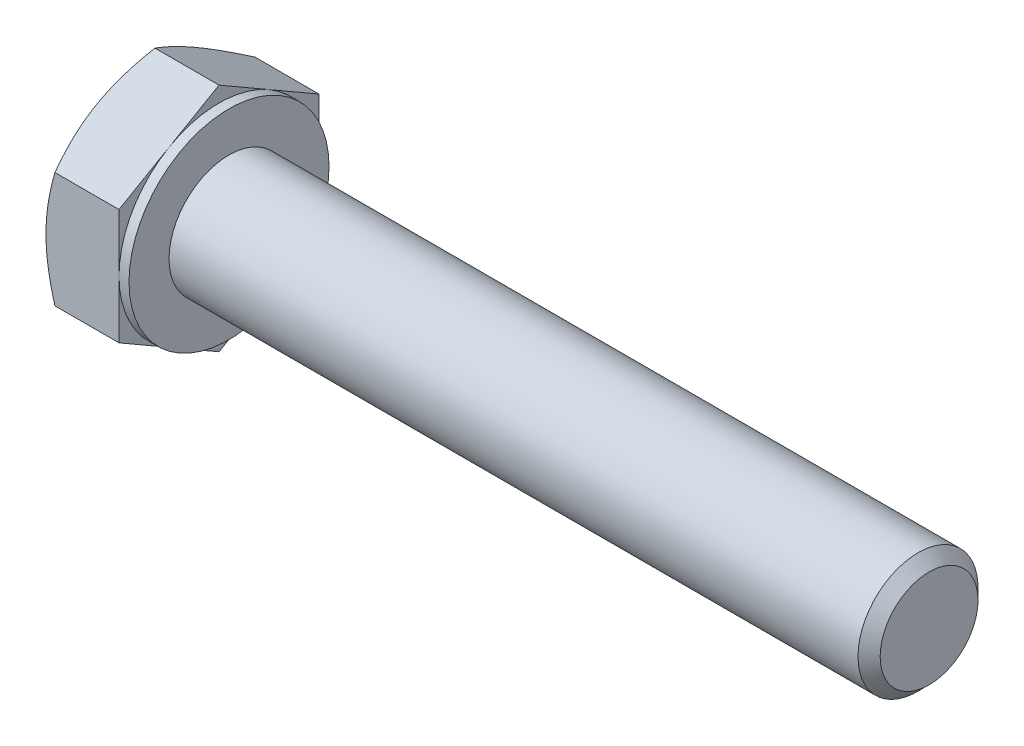
ISO-10303-21;
HEADER;
FILE_DESCRIPTION(('STEP AP214'),'2;1');
FILE_NAME('part.step','',(''),(''),'','','');
FILE_SCHEMA(('AUTOMOTIVE_DESIGN { 1 0 10303 214 1 1 1 1 }'));
ENDSEC;
DATA;
#1=APPLICATION_CONTEXT('core data for automotive mechanical design processes');
#2=APPLICATION_PROTOCOL_DEFINITION('international standard','automotive_design',2000,#1);
#3=PRODUCT_CONTEXT('',#1,'mechanical');
#4=PRODUCT('Part','Part','',(#3));
#5=PRODUCT_RELATED_PRODUCT_CATEGORY('part','',(#4));
#6=PRODUCT_DEFINITION_FORMATION('','',#4);
#7=PRODUCT_DEFINITION_CONTEXT('part definition',#1,'design');
#8=PRODUCT_DEFINITION('design','',#6,#7);
#9=PRODUCT_DEFINITION_SHAPE('','',#8);
#10=(LENGTH_UNIT() NAMED_UNIT(*) SI_UNIT(.MILLI.,.METRE.));
#11=(NAMED_UNIT(*) PLANE_ANGLE_UNIT() SI_UNIT($,.RADIAN.));
#12=(NAMED_UNIT(*) SI_UNIT($,.STERADIAN.) SOLID_ANGLE_UNIT());
#13=UNCERTAINTY_MEASURE_WITH_UNIT(LENGTH_MEASURE(1.E-05),#10,'distance_accuracy_value','');
#14=(GEOMETRIC_REPRESENTATION_CONTEXT(3) GLOBAL_UNCERTAINTY_ASSIGNED_CONTEXT((#13)) GLOBAL_UNIT_ASSIGNED_CONTEXT((#10,
#11,#12)) REPRESENTATION_CONTEXT('',''));
#15=CARTESIAN_POINT('',(0.,0.,0.));
#16=DIRECTION('',(0.,0.,1.));
#17=DIRECTION('',(1.,0.,0.));
#18=AXIS2_PLACEMENT_3D('',#15,#16,#17);
#19=CARTESIAN_POINT('',(0.,5.77350269189626,0.));
#20=DIRECTION('',(1.,0.,0.));
#21=DIRECTION('',(0.,0.,-1.));
#22=AXIS2_PLACEMENT_3D('',#19,#20,#21);
#23=PLANE('',#22);
#24=CARTESIAN_POINT('',(0.,0.,0.));
#25=DIRECTION('',(1.,0.,0.));
#26=DIRECTION('',(0.,1.,0.));
#27=AXIS2_PLACEMENT_3D('',#24,#25,#26);
#28=CIRCLE('',#27,4.99999999999545);
#29=CARTESIAN_POINT('',(1.31354746459353E-12,-4.33012701892023,-2.49999999999886));
#30=VERTEX_POINT('',#29);
#31=CARTESIAN_POINT('',(1.31275345242458E-12,0.,-4.99999999999773));
#32=VERTEX_POINT('',#31);
#33=EDGE_CURVE('E85',#30,#32,#28,.T.);
#34=ORIENTED_EDGE('',*,*,#33,.F.);
#35=CARTESIAN_POINT('',(0.,0.,0.));
#36=DIRECTION('',(1.,0.,0.));
#37=DIRECTION('',(0.,1.,0.));
#38=AXIS2_PLACEMENT_3D('',#35,#36,#37);
#39=CIRCLE('',#38,4.99999999999545);
#40=CARTESIAN_POINT('',(1.31121862056009E-12,-4.33012701892022,2.49999999999887));
#41=VERTEX_POINT('',#40);
#42=EDGE_CURVE('E20',#41,#30,#39,.T.);
#43=ORIENTED_EDGE('',*,*,#42,.F.);
#44=CARTESIAN_POINT('',(0.,0.,0.));
#45=DIRECTION('',(1.,0.,0.));
#46=DIRECTION('',(0.,1.,0.));
#47=AXIS2_PLACEMENT_3D('',#44,#45,#46);
#48=CIRCLE('',#47,4.99999999999545);
#49=CARTESIAN_POINT('',(1.31264084998215E-12,0.,4.99999999999773));
#50=VERTEX_POINT('',#49);
#51=EDGE_CURVE('E425',#50,#41,#48,.T.);
#52=ORIENTED_EDGE('',*,*,#51,.F.);
#53=CARTESIAN_POINT('',(0.,0.,0.));
#54=DIRECTION('',(1.,0.,0.));
#55=DIRECTION('',(0.,1.,0.));
#56=AXIS2_PLACEMENT_3D('',#53,#54,#55);
#57=CIRCLE('',#56,4.99999999999545);
#58=CARTESIAN_POINT('',(1.31332709353662E-12,4.33012701892022,2.49999999999887));
#59=VERTEX_POINT('',#58);
#60=EDGE_CURVE('E143',#59,#50,#57,.T.);
#61=ORIENTED_EDGE('',*,*,#60,.F.);
#62=CARTESIAN_POINT('',(0.,0.,0.));
#63=DIRECTION('',(1.,0.,0.));
#64=DIRECTION('',(0.,1.,0.));
#65=AXIS2_PLACEMENT_3D('',#62,#63,#64);
#66=CIRCLE('',#65,4.99999999999545);
#67=CARTESIAN_POINT('',(1.31270362434763E-12,4.33012701892022,-2.49999999999887));
#68=VERTEX_POINT('',#67);
#69=EDGE_CURVE('E426',#68,#59,#66,.T.);
#70=ORIENTED_EDGE('',*,*,#69,.F.);
#71=CARTESIAN_POINT('',(0.,0.,0.));
#72=DIRECTION('',(1.,0.,0.));
#73=DIRECTION('',(0.,1.,0.));
#74=AXIS2_PLACEMENT_3D('',#71,#72,#73);
#75=CIRCLE('',#74,4.99999999999545);
#76=EDGE_CURVE('E88',#32,#68,#75,.T.);
#77=ORIENTED_EDGE('',*,*,#76,.F.);
#78=EDGE_LOOP('',(#34,#43,#52,#61,#70,#77));
#79=FACE_BOUND('',#78,.T.);
#80=ADVANCED_FACE('F17',(#79),#23,.F.);
#81=CARTESIAN_POINT('',(0.449261479275265,0.,0.));
#82=DIRECTION('',(1.,0.,0.));
#83=DIRECTION('',(0.,1.,0.));
#84=AXIS2_PLACEMENT_3D('',#81,#82,#83);
#85=CONICAL_SURFACE('',#84,5.77814370797114,1.04719755118957);
#86=ORIENTED_EDGE('',*,*,#42,.T.);
#87=CARTESIAN_POINT('',(2.62704765214054E-12,-4.3301270189222,-2.5));
#88=CARTESIAN_POINT('',(-2.0434811056066E-05,-4.39139021902688,-2.39388902478443));
#89=CARTESIAN_POINT('',(0.00259979047148857,-4.45265046787549,-2.28778316129432));
#90=CARTESIAN_POINT('',(0.0129696792605237,-4.57505068020448,-2.07577977468329));
#91=CARTESIAN_POINT('',(0.020718327300213,-4.63619066509475,-1.96988221447935));
#92=CARTESIAN_POINT('',(0.0411421551416449,-4.75795543372631,-1.75897944863763));
#93=CARTESIAN_POINT('',(0.05379253368077,-4.81858126545495,-1.6539724278325));
#94=CARTESIAN_POINT('',(0.0837477080387027,-4.93954408647721,-1.44445867599508));
#95=CARTESIAN_POINT('',(0.101052626368536,-4.99988106812553,-1.33995195820484));
#96=CARTESIAN_POINT('',(0.159414596574626,-5.18020863614853,-1.02761544838367));
#97=CARTESIAN_POINT('',(0.206947202600607,-5.29967536418135,-0.820693005616806));
#98=CARTESIAN_POINT('',(0.3165695496968,-5.53758145884731,-0.408627562225077));
#99=CARTESIAN_POINT('',(0.37873199161361,-5.65601252710132,-0.203498934814473));
#100=CARTESIAN_POINT('',(0.446581987394316,-5.77350269189494,-2.27841681610176E-12));
#101=B_SPLINE_CURVE_WITH_KNOTS('',3,(#87,#88,#89,#90,#91,#92,#93,#94,#95,#96,#97,#98,#99,#100),
.UNSPECIFIED.,.F.,.F.,(4,2,2,2,2,2,4),(0.,0.367541688500244,0.735010622708302,1.10064405638254,
1.46628711474859,2.19661488877263,2.93065154716301),.UNSPECIFIED.);
#102=CARTESIAN_POINT('',(0.446581987394316,-5.77350269189494,0.));
#103=VERTEX_POINT('',#102);
#104=EDGE_CURVE('E100',#30,#103,#101,.T.);
#105=ORIENTED_EDGE('',*,*,#104,.T.);
#106=CARTESIAN_POINT('',(0.446581987394316,-5.77350269189494,2.27887825987949E-12));
#107=CARTESIAN_POINT('',(0.378731991613609,-5.65601252710132,0.203498934814475));
#108=CARTESIAN_POINT('',(0.316569549696798,-5.53758145884731,0.408627562225079));
#109=CARTESIAN_POINT('',(0.206947202600605,-5.29967536418135,0.820693005616809));
#110=CARTESIAN_POINT('',(0.159414596574623,-5.18020863614852,1.02761544838368));
#111=CARTESIAN_POINT('',(0.101052626368532,-4.99988106812552,1.33995195820485));
#112=CARTESIAN_POINT('',(0.0837477080386989,-4.9395440864772,1.44445867599509));
#113=CARTESIAN_POINT('',(0.0537925336807657,-4.81858126545494,1.65397242783251));
#114=CARTESIAN_POINT('',(0.0411421551416406,-4.7579554337263,1.75897944863763));
#115=CARTESIAN_POINT('',(0.0207183273002085,-4.63619066509474,1.96988221447936));
#116=CARTESIAN_POINT('',(0.012969679260519,-4.57505068020447,2.0757797746833));
#117=CARTESIAN_POINT('',(0.00259979047148364,-4.45265046787548,2.28778316129432));
#118=CARTESIAN_POINT('',(-2.04348110610126E-05,-4.39139021902686,2.39388902478444));
#119=CARTESIAN_POINT('',(2.62241692865757E-12,-4.33012701892218,2.50000000000001));
#120=B_SPLINE_CURVE_WITH_KNOTS('',3,(#106,#107,#108,#109,#110,#111,#112,#113,#114,#115,#116,
#117,#118,#119),.UNSPECIFIED.,.F.,.F.,(4,2,2,2,2,2,4),(0.,0.734036658390386,1.46436443241443,
1.83000749078048,2.19564092445472,2.56310985866278,2.93065154716303),.UNSPECIFIED.);
#121=EDGE_CURVE('E106',#103,#41,#120,.T.);
#122=ORIENTED_EDGE('',*,*,#121,.T.);
#123=EDGE_LOOP('',(#86,#105,#122));
#124=FACE_BOUND('',#123,.T.);
#125=ADVANCED_FACE('F104',(#124),#85,.T.);
#126=CARTESIAN_POINT('',(0.449261479275265,0.,0.));
#127=DIRECTION('',(1.,0.,0.));
#128=DIRECTION('',(0.,1.,0.));
#129=AXIS2_PLACEMENT_3D('',#126,#127,#128);
#130=CONICAL_SURFACE('',#129,5.77814370797114,1.04719755118957);
#131=ORIENTED_EDGE('',*,*,#33,.T.);
#132=CARTESIAN_POINT('',(2.62554162158813E-12,0.,-5.));
#133=CARTESIAN_POINT('',(-2.04348110577706E-05,-0.122526400209367,-5.));
#134=CARTESIAN_POINT('',(0.00259979047148719,-0.24504689790661,-5.));
#135=CARTESIAN_POINT('',(0.0129696792605238,-0.4898473225646,-5.));
#136=CARTESIAN_POINT('',(0.0207183273002142,-0.61212729234515,-5.));
#137=CARTESIAN_POINT('',(0.0411421551416489,-0.855656829608277,-5.));
#138=CARTESIAN_POINT('',(0.0537925336807756,-0.976908493065564,-5.));
#139=CARTESIAN_POINT('',(0.0837477080387122,-1.21883413511011,-5.));
#140=CARTESIAN_POINT('',(0.101052626368547,-1.33950809840675,-5.));
#141=CARTESIAN_POINT('',(0.159414596574645,-1.70016323445278,-5.));
#142=CARTESIAN_POINT('',(0.206947202600632,-1.93909669051844,-5.));
#143=CARTESIAN_POINT('',(0.316569549696838,-2.41490887985039,-5.));
#144=CARTESIAN_POINT('',(0.378731991613655,-2.65177101635842,-5.));
#145=CARTESIAN_POINT('',(0.446581987394369,-2.88675134594568,-5.));
#146=B_SPLINE_CURVE_WITH_KNOTS('',3,(#132,#133,#134,#135,#136,#137,#138,#139,#140,#141,#142,
#143,#144,#145),.UNSPECIFIED.,.F.,.F.,(4,2,2,2,2,2,4),(0.,0.367541688500269,0.735010622708351,
1.10064405638261,1.46628711474869,2.19661488877278,2.93065154716321),.UNSPECIFIED.);
#147=CARTESIAN_POINT('',(0.446581987394308,-2.88675134594763,-4.99999999999875));
#148=VERTEX_POINT('',#147);
#149=EDGE_CURVE('E95',#32,#148,#146,.T.);
#150=ORIENTED_EDGE('',*,*,#149,.T.);
#151=CARTESIAN_POINT('',(0.446581987394246,-2.88675134594957,-4.99999999999751));
#152=CARTESIAN_POINT('',(0.37873199161355,-3.00424151074319,-4.79650106518533));
#153=CARTESIAN_POINT('',(0.316569549696749,-3.12267257899719,-4.59137243777474));
#154=CARTESIAN_POINT('',(0.206947202600573,-3.36057867366312,-4.17930699438305));
#155=CARTESIAN_POINT('',(0.159414596574599,-3.48004540169594,-3.9723845516162));
#156=CARTESIAN_POINT('',(0.101052626368518,-3.66037296971892,-3.66004804179506));
#157=CARTESIAN_POINT('',(0.0837477080386884,-3.72070995136724,-3.55554132400483));
#158=CARTESIAN_POINT('',(0.0537925336807608,-3.84167277238949,-3.34602757216742));
#159=CARTESIAN_POINT('',(0.0411421551416378,-3.90229860411813,-3.24102055136231));
#160=CARTESIAN_POINT('',(0.0207183273002091,-4.02406337274967,-3.0301177855206));
#161=CARTESIAN_POINT('',(0.0129696792605209,-4.08520335763994,-2.92422022531667));
#162=CARTESIAN_POINT('',(0.00259979047148748,-4.20760356996891,-2.71221683870566));
#163=CARTESIAN_POINT('',(-2.04348110565836E-05,-4.26886381881752,-2.60611097521555));
#164=CARTESIAN_POINT('',(2.62707461672446E-12,-4.3301270189222,-2.5));
#165=B_SPLINE_CURVE_WITH_KNOTS('',3,(#151,#152,#153,#154,#155,#156,#157,#158,#159,#160,#161,
#162,#163,#164),.UNSPECIFIED.,.F.,.F.,(4,2,2,2,2,2,4),(0.,0.734036658390319,1.46436443241429,
1.83000749078032,2.19564092445452,2.56310985866255,2.93065154716276),.UNSPECIFIED.);
#166=EDGE_CURVE('E93',#148,#30,#165,.T.);
#167=ORIENTED_EDGE('',*,*,#166,.T.);
#168=EDGE_LOOP('',(#131,#150,#167));
#169=FACE_BOUND('',#168,.T.);
#170=ADVANCED_FACE('F94',(#169),#130,.T.);
#171=CARTESIAN_POINT('',(0.449261479275265,0.,0.));
#172=DIRECTION('',(1.,0.,0.));
#173=DIRECTION('',(0.,1.,0.));
#174=AXIS2_PLACEMENT_3D('',#171,#172,#173);
#175=CONICAL_SURFACE('',#174,5.77814370797114,1.04719755118957);
#176=CARTESIAN_POINT('',(0.446581987394313,2.88675134594549,-5.));
#177=CARTESIAN_POINT('',(0.378731991613607,2.65177101635825,-5.));
#178=CARTESIAN_POINT('',(0.316569549696797,2.41490887985023,-5.));
#179=CARTESIAN_POINT('',(0.206947202600605,1.93909669051831,-5.));
#180=CARTESIAN_POINT('',(0.159414596574625,1.70016323445266,-5.));
#181=CARTESIAN_POINT('',(0.101052626368534,1.33950809840666,-5.));
#182=CARTESIAN_POINT('',(0.0837477080387007,1.21883413511003,-5.));
#183=CARTESIAN_POINT('',(0.053792533680768,0.976908493065498,-5.));
#184=CARTESIAN_POINT('',(0.0411421551416434,0.855656829608219,-5.));
#185=CARTESIAN_POINT('',(0.0207183273002116,0.612127292345108,-5.));
#186=CARTESIAN_POINT('',(0.0129696792605218,0.489847322564566,-5.));
#187=CARTESIAN_POINT('',(0.00259979047148614,0.245046897906593,-5.));
#188=CARTESIAN_POINT('',(-2.0434811058531E-05,0.122526400209358,-5.));
#189=CARTESIAN_POINT('',(2.62550690484915E-12,0.,-5.));
#190=B_SPLINE_CURVE_WITH_KNOTS('',3,(#176,#177,#178,#179,#180,#181,#182,#183,#184,#185,#186,
#187,#188,#189),.UNSPECIFIED.,.F.,.F.,(4,2,2,2,2,2,4),(0.,0.734036658390381,1.46436443241442,
1.83000749078047,2.19564092445471,2.56310985866277,2.93065154716301),.UNSPECIFIED.);
#191=CARTESIAN_POINT('',(0.446581987394314,2.88675134594747,-4.99999999999886));
#192=VERTEX_POINT('',#191);
#193=EDGE_CURVE('E114',#192,#32,#190,.T.);
#194=ORIENTED_EDGE('',*,*,#193,.T.);
#195=ORIENTED_EDGE('',*,*,#76,.T.);
#196=CARTESIAN_POINT('',(2.62553917971795E-12,4.33012701892219,-2.50000000000001));
#197=CARTESIAN_POINT('',(-2.04348110580692E-05,4.26886381881751,-2.60611097521557));
#198=CARTESIAN_POINT('',(0.0025997904714865,4.20760356996889,-2.71221683870569));
#199=CARTESIAN_POINT('',(0.0129696792605217,4.08520335763991,-2.92422022531671));
#200=CARTESIAN_POINT('',(0.0207183273002111,4.02406337274963,-3.03011778552065));
#201=CARTESIAN_POINT('',(0.0411421551416427,3.90229860411808,-3.24102055136238));
#202=CARTESIAN_POINT('',(0.0537925336807675,3.84167277238944,-3.3460275721675));
#203=CARTESIAN_POINT('',(0.0837477080387005,3.72070995136717,-3.55554132400492));
#204=CARTESIAN_POINT('',(0.101052626368534,3.66037296971886,-3.66004804179516));
#205=CARTESIAN_POINT('',(0.159414596574625,3.48004540169586,-3.97238455161633));
#206=CARTESIAN_POINT('',(0.206947202600605,3.36057867366303,-4.1793069943832));
#207=CARTESIAN_POINT('',(0.316569549696797,3.12267257899707,-4.59137243777492));
#208=CARTESIAN_POINT('',(0.378731991613607,3.00424151074306,-4.79650106518553));
#209=CARTESIAN_POINT('',(0.446581987394314,2.88675134594944,-4.99999999999772));
#210=B_SPLINE_CURVE_WITH_KNOTS('',3,(#196,#197,#198,#199,#200,#201,#202,#203,#204,#205,#206,
#207,#208,#209),.UNSPECIFIED.,.F.,.F.,(4,2,2,2,2,2,4),(0.,0.367541688500244,0.735010622708301,
1.10064405638254,1.46628711474859,2.19661488877263,2.93065154716301),.UNSPECIFIED.);
#211=EDGE_CURVE('E219',#68,#192,#210,.T.);
#212=ORIENTED_EDGE('',*,*,#211,.T.);
#213=EDGE_LOOP('',(#194,#195,#212));
#214=FACE_BOUND('',#213,.T.);
#215=ADVANCED_FACE('F209',(#214),#175,.T.);
#216=CARTESIAN_POINT('',(0.449261479275265,0.,0.));
#217=DIRECTION('',(1.,0.,0.));
#218=DIRECTION('',(0.,1.,0.));
#219=AXIS2_PLACEMENT_3D('',#216,#217,#218);
#220=CONICAL_SURFACE('',#219,5.77814370797114,1.04719755118957);
#221=CARTESIAN_POINT('',(0.446581987394318,5.77350269189495,-2.27826542665357E-12));
#222=CARTESIAN_POINT('',(0.378731991613612,5.65601252710132,-0.203498934814473));
#223=CARTESIAN_POINT('',(0.316569549696801,5.53758145884731,-0.408627562225078));
#224=CARTESIAN_POINT('',(0.206947202600608,5.29967536418135,-0.820693005616809));
#225=CARTESIAN_POINT('',(0.159414596574626,5.18020863614853,-1.02761544838368));
#226=CARTESIAN_POINT('',(0.101052626368535,4.99988106812553,-1.33995195820484));
#227=CARTESIAN_POINT('',(0.0837477080387012,4.93954408647721,-1.44445867599509));
#228=CARTESIAN_POINT('',(0.0537925336807684,4.81858126545494,-1.65397242783251));
#229=CARTESIAN_POINT('',(0.0411421551416436,4.7579554337263,-1.75897944863763));
#230=CARTESIAN_POINT('',(0.0207183273002115,4.63619066509474,-1.96988221447936));
#231=CARTESIAN_POINT('',(0.0129696792605217,4.57505068020447,-2.0757797746833));
#232=CARTESIAN_POINT('',(0.00259979047148602,4.45265046787549,-2.28778316129432));
#233=CARTESIAN_POINT('',(-2.04348110585645E-05,4.39139021902687,-2.39388902478444));
#234=CARTESIAN_POINT('',(2.62567794692432E-12,4.33012701892219,-2.50000000000001));
#235=B_SPLINE_CURVE_WITH_KNOTS('',3,(#221,#222,#223,#224,#225,#226,#227,#228,#229,#230,#231,
#232,#233,#234),.UNSPECIFIED.,.F.,.F.,(4,2,2,2,2,2,4),(0.,0.734036658390386,1.46436443241443,
1.83000749078048,2.19564092445472,2.56310985866278,2.93065154716303),.UNSPECIFIED.);
#236=CARTESIAN_POINT('',(0.446581987394318,5.77350269189495,0.));
#237=VERTEX_POINT('',#236);
#238=EDGE_CURVE('E214',#237,#68,#235,.T.);
#239=ORIENTED_EDGE('',*,*,#238,.T.);
#240=ORIENTED_EDGE('',*,*,#69,.T.);
#241=CARTESIAN_POINT('',(2.62627457230914E-12,4.33012701892219,2.50000000000001));
#242=CARTESIAN_POINT('',(-2.04348110574818E-05,4.39139021902687,2.39388902478444));
#243=CARTESIAN_POINT('',(0.00259979047148711,4.45265046787549,2.28778316129432));
#244=CARTESIAN_POINT('',(0.0129696792605226,4.57505068020448,2.0757797746833));
#245=CARTESIAN_POINT('',(0.0207183273002123,4.63619066509475,1.96988221447936));
#246=CARTESIAN_POINT('',(0.0411421551416445,4.7579554337263,1.75897944863763));
#247=CARTESIAN_POINT('',(0.0537925336807697,4.81858126545494,1.65397242783251));
#248=CARTESIAN_POINT('',(0.0837477080387026,4.93954408647721,1.44445867599508));
#249=CARTESIAN_POINT('',(0.101052626368536,4.99988106812553,1.33995195820484));
#250=CARTESIAN_POINT('',(0.159414596574626,5.18020863614853,1.02761544838368));
#251=CARTESIAN_POINT('',(0.206947202600608,5.29967536418135,0.820693005616809));
#252=CARTESIAN_POINT('',(0.316569549696801,5.53758145884731,0.408627562225079));
#253=CARTESIAN_POINT('',(0.378731991613612,5.65601252710132,0.203498934814474));
#254=CARTESIAN_POINT('',(0.446581987394318,5.77350269189495,2.27899166758682E-12));
#255=B_SPLINE_CURVE_WITH_KNOTS('',3,(#241,#242,#243,#244,#245,#246,#247,#248,#249,#250,#251,
#252,#253,#254),.UNSPECIFIED.,.F.,.F.,(4,2,2,2,2,2,4),(0.,0.367541688500246,0.735010622708305,
1.10064405638255,1.4662871147486,2.19661488877264,2.93065154716302),.UNSPECIFIED.);
#256=EDGE_CURVE('E201',#59,#237,#255,.T.);
#257=ORIENTED_EDGE('',*,*,#256,.T.);
#258=EDGE_LOOP('',(#239,#240,#257));
#259=FACE_BOUND('',#258,.T.);
#260=ADVANCED_FACE('F206',(#259),#220,.T.);
#261=CARTESIAN_POINT('',(0.449261479275265,0.,0.));
#262=DIRECTION('',(1.,0.,0.));
#263=DIRECTION('',(0.,1.,0.));
#264=AXIS2_PLACEMENT_3D('',#261,#262,#263);
#265=CONICAL_SURFACE('',#264,5.77814370797114,1.04719755118957);
#266=ORIENTED_EDGE('',*,*,#51,.T.);
#267=CARTESIAN_POINT('',(2.62230380524474E-12,-4.33012701892218,2.50000000000001));
#268=CARTESIAN_POINT('',(-2.04348110611277E-05,-4.2688638188175,2.60611097521557));
#269=CARTESIAN_POINT('',(0.00259979047148344,-4.20760356996889,2.71221683870569));
#270=CARTESIAN_POINT('',(0.0129696792605186,-4.0852033576399,2.92422022531671));
#271=CARTESIAN_POINT('',(0.020718327300208,-4.02406337274963,3.03011778552065));
#272=CARTESIAN_POINT('',(0.0411421551416399,-3.90229860411807,3.24102055136238));
#273=CARTESIAN_POINT('',(0.0537925336807649,-3.84167277238943,3.3460275721675));
#274=CARTESIAN_POINT('',(0.0837477080386977,-3.72070995136717,3.55554132400492));
#275=CARTESIAN_POINT('',(0.101052626368531,-3.66037296971885,3.66004804179516));
#276=CARTESIAN_POINT('',(0.159414596574621,-3.48004540169585,3.97238455161633));
#277=CARTESIAN_POINT('',(0.206947202600603,-3.36057867366302,4.17930699438319));
#278=CARTESIAN_POINT('',(0.316569549696795,-3.12267257899707,4.59137243777492));
#279=CARTESIAN_POINT('',(0.378731991613605,-3.00424151074305,4.79650106518553));
#280=CARTESIAN_POINT('',(0.446581987394311,-2.88675134594943,4.99999999999772));
#281=B_SPLINE_CURVE_WITH_KNOTS('',3,(#267,#268,#269,#270,#271,#272,#273,#274,#275,#276,#277,
#278,#279,#280),.UNSPECIFIED.,.F.,.F.,(4,2,2,2,2,2,4),(0.,0.367541688500243,0.7350106227083,
1.10064405638254,1.46628711474859,2.19661488877263,2.93065154716301),.UNSPECIFIED.);
#282=CARTESIAN_POINT('',(0.446581987394691,-2.88675134594877,4.99999999999886));
#283=VERTEX_POINT('',#282);
#284=EDGE_CURVE('E101',#41,#283,#281,.T.);
#285=ORIENTED_EDGE('',*,*,#284,.T.);
#286=CARTESIAN_POINT('',(0.446581987394311,-2.88675134594548,5.));
#287=CARTESIAN_POINT('',(0.378731991613606,-2.65177101635824,5.));
#288=CARTESIAN_POINT('',(0.316569549696796,-2.41490887985022,5.));
#289=CARTESIAN_POINT('',(0.206947202600604,-1.93909669051831,5.));
#290=CARTESIAN_POINT('',(0.159414596574623,-1.70016323445266,5.));
#291=CARTESIAN_POINT('',(0.101052626368533,-1.33950809840666,5.));
#292=CARTESIAN_POINT('',(0.0837477080386997,-1.21883413511002,5.));
#293=CARTESIAN_POINT('',(0.0537925336807673,-0.976908493065495,5.));
#294=CARTESIAN_POINT('',(0.0411421551416425,-0.855656829608217,5.));
#295=CARTESIAN_POINT('',(0.0207183273002108,-0.612127292345106,5.));
#296=CARTESIAN_POINT('',(0.0129696792605213,-0.489847322564565,5.));
#297=CARTESIAN_POINT('',(0.00259979047148604,-0.245046897906593,5.));
#298=CARTESIAN_POINT('',(-2.04348110585226E-05,-0.122526400209359,5.));
#299=CARTESIAN_POINT('',(2.6252816999643E-12,0.,5.));
#300=B_SPLINE_CURVE_WITH_KNOTS('',3,(#286,#287,#288,#289,#290,#291,#292,#293,#294,#295,#296,
#297,#298,#299),.UNSPECIFIED.,.F.,.F.,(4,2,2,2,2,2,4),(0.,0.734036658390379,1.46436443241441,
1.83000749078047,2.1956409244547,2.56310985866276,2.930651547163),.UNSPECIFIED.);
#301=EDGE_CURVE('E180',#283,#50,#300,.T.);
#302=ORIENTED_EDGE('',*,*,#301,.T.);
#303=EDGE_LOOP('',(#266,#285,#302));
#304=FACE_BOUND('',#303,.T.);
#305=ADVANCED_FACE('F158',(#304),#265,.T.);
#306=CARTESIAN_POINT('',(0.449261479275265,0.,0.));
#307=DIRECTION('',(1.,0.,0.));
#308=DIRECTION('',(0.,1.,0.));
#309=AXIS2_PLACEMENT_3D('',#306,#307,#308);
#310=CONICAL_SURFACE('',#309,5.77814370797114,1.04719755118957);
#311=CARTESIAN_POINT('',(0.446581987394315,2.88675134594944,4.99999999999772));
#312=CARTESIAN_POINT('',(0.378731991613609,3.00424151074306,4.79650106518553));
#313=CARTESIAN_POINT('',(0.316569549696799,3.12267257899707,4.59137243777492));
#314=CARTESIAN_POINT('',(0.206947202600606,3.36057867366303,4.1793069943832));
#315=CARTESIAN_POINT('',(0.159414596574625,3.48004540169586,3.97238455161633));
#316=CARTESIAN_POINT('',(0.101052626368535,3.66037296971886,3.66004804179516));
#317=CARTESIAN_POINT('',(0.0837477080387017,3.72070995136718,3.55554132400492));
#318=CARTESIAN_POINT('',(0.0537925336807689,3.84167277238944,3.3460275721675));
#319=CARTESIAN_POINT('',(0.0411421551416438,3.90229860411808,3.24102055136238));
#320=CARTESIAN_POINT('',(0.0207183273002118,4.02406337274964,3.03011778552065));
#321=CARTESIAN_POINT('',(0.0129696792605224,4.08520335763991,2.92422022531671));
#322=CARTESIAN_POINT('',(0.00259979047148728,4.20760356996889,2.71221683870569));
#323=CARTESIAN_POINT('',(-2.04348110572205E-05,4.26886381881751,2.60611097521557));
#324=CARTESIAN_POINT('',(2.62637439788308E-12,4.33012701892219,2.50000000000001));
#325=B_SPLINE_CURVE_WITH_KNOTS('',3,(#311,#312,#313,#314,#315,#316,#317,#318,#319,#320,#321,
#322,#323,#324),.UNSPECIFIED.,.F.,.F.,(4,2,2,2,2,2,4),(0.,0.734036658390382,1.46436443241442,
1.83000749078047,2.19564092445471,2.56310985866277,2.93065154716301),.UNSPECIFIED.);
#326=CARTESIAN_POINT('',(0.446581987394315,2.88675134594747,4.99999999999886));
#327=VERTEX_POINT('',#326);
#328=EDGE_CURVE('E164',#327,#59,#325,.T.);
#329=ORIENTED_EDGE('',*,*,#328,.T.);
#330=ORIENTED_EDGE('',*,*,#60,.T.);
#331=CARTESIAN_POINT('',(2.62529284589109E-12,0.,5.));
#332=CARTESIAN_POINT('',(-2.04348110587185E-05,0.122526400209358,5.));
#333=CARTESIAN_POINT('',(0.00259979047148596,0.245046897906593,5.));
#334=CARTESIAN_POINT('',(0.0129696792605216,0.489847322564566,5.));
#335=CARTESIAN_POINT('',(0.0207183273002114,0.612127292345108,5.));
#336=CARTESIAN_POINT('',(0.0411421551416433,0.855656829608219,5.));
#337=CARTESIAN_POINT('',(0.0537925336807679,0.976908493065498,5.));
#338=CARTESIAN_POINT('',(0.0837477080387005,1.21883413511003,5.));
#339=CARTESIAN_POINT('',(0.101052626368534,1.33950809840666,5.));
#340=CARTESIAN_POINT('',(0.159414596574625,1.70016323445266,5.));
#341=CARTESIAN_POINT('',(0.206947202600606,1.93909669051831,5.));
#342=CARTESIAN_POINT('',(0.316569549696798,2.41490887985023,5.));
#343=CARTESIAN_POINT('',(0.378731991613608,2.65177101635825,5.));
#344=CARTESIAN_POINT('',(0.446581987394315,2.88675134594549,5.));
#345=B_SPLINE_CURVE_WITH_KNOTS('',3,(#331,#332,#333,#334,#335,#336,#337,#338,#339,#340,#341,
#342,#343,#344),.UNSPECIFIED.,.F.,.F.,(4,2,2,2,2,2,4),(0.,0.367541688500244,0.735010622708302,
1.10064405638254,1.46628711474859,2.19661488877263,2.93065154716301),.UNSPECIFIED.);
#346=EDGE_CURVE('E172',#50,#327,#345,.T.);
#347=ORIENTED_EDGE('',*,*,#346,.T.);
#348=EDGE_LOOP('',(#329,#330,#347));
#349=FACE_BOUND('',#348,.T.);
#350=ADVANCED_FACE('F153',(#349),#310,.T.);
#351=CARTESIAN_POINT('',(4.15,-5.77350269189626,0.));
#352=DIRECTION('',(0.,0.866025403784438,-0.500000000000002));
#353=DIRECTION('',(0.,0.500000000000002,0.866025403784438));
#354=AXIS2_PLACEMENT_3D('',#351,#352,#353);
#355=PLANE('',#354);
#356=DIRECTION('',(1.,0.,0.));
#357=VECTOR('',#356,1.);
#358=CARTESIAN_POINT('',(4.15,-2.88675134594812,5.));
#359=LINE('',#358,#357);
#360=CARTESIAN_POINT('',(3.65,-2.88675134594812,5.));
#361=VERTEX_POINT('',#360);
#362=EDGE_CURVE('E339',#361,#283,#359,.F.);
#363=ORIENTED_EDGE('',*,*,#362,.T.);
#364=ORIENTED_EDGE('',*,*,#284,.F.);
#365=ORIENTED_EDGE('',*,*,#121,.F.);
#366=DIRECTION('',(1.,0.,0.));
#367=VECTOR('',#366,1.);
#368=CARTESIAN_POINT('',(4.15,-5.77350269189626,0.));
#369=LINE('',#368,#367);
#370=CARTESIAN_POINT('',(3.65,-5.77350269189626,0.));
#371=VERTEX_POINT('',#370);
#372=EDGE_CURVE('E112',#103,#371,#369,.T.);
#373=ORIENTED_EDGE('',*,*,#372,.T.);
#374=DIRECTION('',(0.,-0.5,-0.866025403784438));
#375=VECTOR('',#374,1.);
#376=CARTESIAN_POINT('',(3.65,-4.33012701892219,2.50000000000001));
#377=LINE('',#376,#375);
#378=CARTESIAN_POINT('',(3.65,-4.33012701892219,2.50000000000001));
#379=VERTEX_POINT('',#378);
#380=EDGE_CURVE('E293',#379,#371,#377,.T.);
#381=ORIENTED_EDGE('',*,*,#380,.F.);
#382=DIRECTION('',(0.,-0.500000000000003,-0.866025403784437));
#383=VECTOR('',#382,1.);
#384=CARTESIAN_POINT('',(3.65,-2.88675134594812,5.));
#385=LINE('',#384,#383);
#386=EDGE_CURVE('E351',#361,#379,#385,.T.);
#387=ORIENTED_EDGE('',*,*,#386,.F.);
#388=EDGE_LOOP('',(#363,#364,#365,#373,#381,#387));
#389=FACE_BOUND('',#388,.T.);
#390=ADVANCED_FACE('F149',(#389),#355,.F.);
#391=CARTESIAN_POINT('',(4.15,-2.88675134594813,-5.));
#392=DIRECTION('',(0.,0.866025403784439,0.5));
#393=DIRECTION('',(0.,-0.5,0.866025403784439));
#394=AXIS2_PLACEMENT_3D('',#391,#392,#393);
#395=PLANE('',#394);
#396=ORIENTED_EDGE('',*,*,#372,.F.);
#397=ORIENTED_EDGE('',*,*,#104,.F.);
#398=ORIENTED_EDGE('',*,*,#166,.F.);
#399=DIRECTION('',(1.,0.,0.));
#400=VECTOR('',#399,1.);
#401=CARTESIAN_POINT('',(4.15,-2.88675134594852,-5.));
#402=LINE('',#401,#400);
#403=CARTESIAN_POINT('',(3.65,-2.88675134594826,-5.));
#404=VERTEX_POINT('',#403);
#405=EDGE_CURVE('E220',#148,#404,#402,.T.);
#406=ORIENTED_EDGE('',*,*,#405,.T.);
#407=DIRECTION('',(0.,0.499999999999999,-0.866025403784439));
#408=VECTOR('',#407,1.);
#409=CARTESIAN_POINT('',(3.65,-4.33012701892219,-2.5));
#410=LINE('',#409,#408);
#411=CARTESIAN_POINT('',(3.65,-4.33012701892219,-2.5));
#412=VERTEX_POINT('',#411);
#413=EDGE_CURVE('E296',#412,#404,#410,.T.);
#414=ORIENTED_EDGE('',*,*,#413,.F.);
#415=DIRECTION('',(0.,0.500000000000001,-0.866025403784438));
#416=VECTOR('',#415,1.);
#417=CARTESIAN_POINT('',(3.65,-5.77350269189626,0.));
#418=LINE('',#417,#416);
#419=EDGE_CURVE('E287',#371,#412,#418,.T.);
#420=ORIENTED_EDGE('',*,*,#419,.F.);
#421=EDGE_LOOP('',(#396,#397,#398,#406,#414,#420));
#422=FACE_BOUND('',#421,.T.);
#423=ADVANCED_FACE('F109',(#422),#395,.F.);
#424=CARTESIAN_POINT('',(4.15,2.88675134594812,-5.));
#425=DIRECTION('',(0.,0.,1.));
#426=DIRECTION('',(1.,0.,0.));
#427=AXIS2_PLACEMENT_3D('',#424,#425,#426);
#428=PLANE('',#427);
#429=ORIENTED_EDGE('',*,*,#405,.F.);
#430=ORIENTED_EDGE('',*,*,#149,.F.);
#431=ORIENTED_EDGE('',*,*,#193,.F.);
#432=DIRECTION('',(1.,0.,0.));
#433=VECTOR('',#432,1.);
#434=CARTESIAN_POINT('',(4.15,2.88675134594812,-5.));
#435=LINE('',#434,#433);
#436=CARTESIAN_POINT('',(3.65,2.88675134594812,-5.));
#437=VERTEX_POINT('',#436);
#438=EDGE_CURVE('E332',#192,#437,#435,.T.);
#439=ORIENTED_EDGE('',*,*,#438,.T.);
#440=DIRECTION('',(0.,1.,0.));
#441=VECTOR('',#440,1.);
#442=CARTESIAN_POINT('',(3.65,5.,-5.));
#443=LINE('',#442,#441);
#444=CARTESIAN_POINT('',(3.65,0.,-5.));
#445=VERTEX_POINT('',#444);
#446=EDGE_CURVE('E372',#445,#437,#443,.T.);
#447=ORIENTED_EDGE('',*,*,#446,.F.);
#448=DIRECTION('',(0.,1.,0.));
#449=VECTOR('',#448,1.);
#450=CARTESIAN_POINT('',(3.65,5.,-5.));
#451=LINE('',#450,#449);
#452=EDGE_CURVE('E304',#404,#445,#451,.T.);
#453=ORIENTED_EDGE('',*,*,#452,.F.);
#454=EDGE_LOOP('',(#429,#430,#431,#439,#447,#453));
#455=FACE_BOUND('',#454,.T.);
#456=ADVANCED_FACE('F227',(#455),#428,.F.);
#457=CARTESIAN_POINT('',(4.15,2.88675134594812,-5.));
#458=DIRECTION('',(0.,-0.866025403784438,0.500000000000001));
#459=DIRECTION('',(0.,-0.500000000000001,-0.866025403784438));
#460=AXIS2_PLACEMENT_3D('',#457,#458,#459);
#461=PLANE('',#460);
#462=ORIENTED_EDGE('',*,*,#438,.F.);
#463=ORIENTED_EDGE('',*,*,#211,.F.);
#464=ORIENTED_EDGE('',*,*,#238,.F.);
#465=DIRECTION('',(1.,0.,0.));
#466=VECTOR('',#465,1.);
#467=CARTESIAN_POINT('',(4.15,5.77350269189626,0.));
#468=LINE('',#467,#466);
#469=CARTESIAN_POINT('',(3.65,5.77350269189626,0.));
#470=VERTEX_POINT('',#469);
#471=EDGE_CURVE('E205',#237,#470,#468,.T.);
#472=ORIENTED_EDGE('',*,*,#471,.T.);
#473=DIRECTION('',(0.,0.500000000000001,0.866025403784438));
#474=VECTOR('',#473,1.);
#475=CARTESIAN_POINT('',(3.65,4.33012701892219,-2.50000000000001));
#476=LINE('',#475,#474);
#477=CARTESIAN_POINT('',(3.65,4.33012701892219,-2.50000000000001));
#478=VERTEX_POINT('',#477);
#479=EDGE_CURVE('E377',#478,#470,#476,.T.);
#480=ORIENTED_EDGE('',*,*,#479,.F.);
#481=DIRECTION('',(0.,0.500000000000002,0.866025403784438));
#482=VECTOR('',#481,1.);
#483=CARTESIAN_POINT('',(3.65,2.88675134594812,-5.));
#484=LINE('',#483,#482);
#485=EDGE_CURVE('E367',#437,#478,#484,.T.);
#486=ORIENTED_EDGE('',*,*,#485,.F.);
#487=EDGE_LOOP('',(#462,#463,#464,#472,#480,#486));
#488=FACE_BOUND('',#487,.T.);
#489=ADVANCED_FACE('F197',(#488),#461,.F.);
#490=CARTESIAN_POINT('',(4.15,5.77350269189626,0.));
#491=DIRECTION('',(0.,-0.866025403784438,-0.500000000000001));
#492=DIRECTION('',(0.,0.500000000000001,-0.866025403784438));
#493=AXIS2_PLACEMENT_3D('',#490,#491,#492);
#494=PLANE('',#493);
#495=ORIENTED_EDGE('',*,*,#471,.F.);
#496=ORIENTED_EDGE('',*,*,#256,.F.);
#497=ORIENTED_EDGE('',*,*,#328,.F.);
#498=DIRECTION('',(1.,0.,0.));
#499=VECTOR('',#498,1.);
#500=CARTESIAN_POINT('',(4.15,2.88675134594813,5.));
#501=LINE('',#500,#499);
#502=CARTESIAN_POINT('',(3.65,2.88675134594813,5.));
#503=VERTEX_POINT('',#502);
#504=EDGE_CURVE('E179',#327,#503,#501,.T.);
#505=ORIENTED_EDGE('',*,*,#504,.T.);
#506=DIRECTION('',(0.,-0.500000000000001,0.866025403784438));
#507=VECTOR('',#506,1.);
#508=CARTESIAN_POINT('',(3.65,4.33012701892219,2.50000000000001));
#509=LINE('',#508,#507);
#510=CARTESIAN_POINT('',(3.65,4.33012701892219,2.50000000000001));
#511=VERTEX_POINT('',#510);
#512=EDGE_CURVE('E387',#511,#503,#509,.T.);
#513=ORIENTED_EDGE('',*,*,#512,.F.);
#514=DIRECTION('',(0.,-0.500000000000001,0.866025403784438));
#515=VECTOR('',#514,1.);
#516=CARTESIAN_POINT('',(3.65,5.77350269189626,0.));
#517=LINE('',#516,#515);
#518=EDGE_CURVE('E382',#470,#511,#517,.T.);
#519=ORIENTED_EDGE('',*,*,#518,.F.);
#520=EDGE_LOOP('',(#495,#496,#497,#505,#513,#519));
#521=FACE_BOUND('',#520,.T.);
#522=ADVANCED_FACE('F191',(#521),#494,.F.);
#523=CARTESIAN_POINT('',(4.15,2.88675134594813,5.));
#524=DIRECTION('',(0.,0.,-1.));
#525=DIRECTION('',(0.,1.,0.));
#526=AXIS2_PLACEMENT_3D('',#523,#524,#525);
#527=PLANE('',#526);
#528=ORIENTED_EDGE('',*,*,#504,.F.);
#529=ORIENTED_EDGE('',*,*,#346,.F.);
#530=ORIENTED_EDGE('',*,*,#301,.F.);
#531=ORIENTED_EDGE('',*,*,#362,.F.);
#532=DIRECTION('',(0.,1.,0.));
#533=VECTOR('',#532,1.);
#534=CARTESIAN_POINT('',(3.65,5.,5.));
#535=LINE('',#534,#533);
#536=CARTESIAN_POINT('',(3.65,0.,5.));
#537=VERTEX_POINT('',#536);
#538=EDGE_CURVE('E35',#537,#361,#535,.F.);
#539=ORIENTED_EDGE('',*,*,#538,.F.);
#540=DIRECTION('',(0.,1.,0.));
#541=VECTOR('',#540,1.);
#542=CARTESIAN_POINT('',(3.65,5.,5.));
#543=LINE('',#542,#541);
#544=EDGE_CURVE('E311',#503,#537,#543,.F.);
#545=ORIENTED_EDGE('',*,*,#544,.F.);
#546=EDGE_LOOP('',(#528,#529,#530,#531,#539,#545));
#547=FACE_BOUND('',#546,.T.);
#548=ADVANCED_FACE('F186',(#547),#527,.F.);
#549=CARTESIAN_POINT('',(3.65,5.,0.));
#550=DIRECTION('',(1.,0.,0.));
#551=DIRECTION('',(0.,0.,-1.));
#552=AXIS2_PLACEMENT_3D('',#549,#550,#551);
#553=PLANE('',#552);
#554=ORIENTED_EDGE('',*,*,#386,.T.);
#555=CARTESIAN_POINT('',(3.65,0.,0.));
#556=DIRECTION('',(-1.,0.,0.));
#557=DIRECTION('',(0.,0.,1.));
#558=AXIS2_PLACEMENT_3D('',#555,#556,#557);
#559=CIRCLE('',#558,5.);
#560=EDGE_CURVE('E181',#537,#379,#559,.F.);
#561=ORIENTED_EDGE('',*,*,#560,.F.);
#562=ORIENTED_EDGE('',*,*,#538,.T.);
#563=EDGE_LOOP('',(#554,#561,#562));
#564=FACE_BOUND('',#563,.T.);
#565=ADVANCED_FACE('F190',(#564),#553,.T.);
#566=CARTESIAN_POINT('',(3.65,5.,0.));
#567=DIRECTION('',(1.,0.,0.));
#568=DIRECTION('',(0.,0.,-1.));
#569=AXIS2_PLACEMENT_3D('',#566,#567,#568);
#570=PLANE('',#569);
#571=ORIENTED_EDGE('',*,*,#419,.T.);
#572=CARTESIAN_POINT('',(3.65,0.,0.));
#573=DIRECTION('',(-1.,0.,0.));
#574=DIRECTION('',(0.,0.,1.));
#575=AXIS2_PLACEMENT_3D('',#572,#573,#574);
#576=CIRCLE('',#575,5.);
#577=EDGE_CURVE('E290',#379,#412,#576,.F.);
#578=ORIENTED_EDGE('',*,*,#577,.F.);
#579=ORIENTED_EDGE('',*,*,#380,.T.);
#580=EDGE_LOOP('',(#571,#578,#579));
#581=FACE_BOUND('',#580,.T.);
#582=ADVANCED_FACE('F276',(#581),#570,.T.);
#583=CARTESIAN_POINT('',(3.65,5.,0.));
#584=DIRECTION('',(1.,0.,0.));
#585=DIRECTION('',(0.,0.,-1.));
#586=AXIS2_PLACEMENT_3D('',#583,#584,#585);
#587=PLANE('',#586);
#588=ORIENTED_EDGE('',*,*,#452,.T.);
#589=CARTESIAN_POINT('',(3.65,0.,0.));
#590=DIRECTION('',(-1.,0.,0.));
#591=DIRECTION('',(0.,0.,1.));
#592=AXIS2_PLACEMENT_3D('',#589,#590,#591);
#593=CIRCLE('',#592,5.);
#594=EDGE_CURVE('E301',#412,#445,#593,.F.);
#595=ORIENTED_EDGE('',*,*,#594,.F.);
#596=ORIENTED_EDGE('',*,*,#413,.T.);
#597=EDGE_LOOP('',(#588,#595,#596));
#598=FACE_BOUND('',#597,.T.);
#599=ADVANCED_FACE('F273',(#598),#587,.T.);
#600=CARTESIAN_POINT('',(3.65,5.,0.));
#601=DIRECTION('',(1.,0.,0.));
#602=DIRECTION('',(0.,0.,-1.));
#603=AXIS2_PLACEMENT_3D('',#600,#601,#602);
#604=PLANE('',#603);
#605=CARTESIAN_POINT('',(3.65,0.,0.));
#606=DIRECTION('',(-1.,0.,0.));
#607=DIRECTION('',(0.,0.,1.));
#608=AXIS2_PLACEMENT_3D('',#605,#606,#607);
#609=CIRCLE('',#608,5.);
#610=EDGE_CURVE('E307',#445,#478,#609,.F.);
#611=ORIENTED_EDGE('',*,*,#610,.F.);
#612=ORIENTED_EDGE('',*,*,#446,.T.);
#613=ORIENTED_EDGE('',*,*,#485,.T.);
#614=EDGE_LOOP('',(#611,#612,#613));
#615=FACE_BOUND('',#614,.T.);
#616=ADVANCED_FACE('F269',(#615),#604,.T.);
#617=CARTESIAN_POINT('',(3.65,5.,0.));
#618=DIRECTION('',(1.,0.,0.));
#619=DIRECTION('',(0.,0.,-1.));
#620=AXIS2_PLACEMENT_3D('',#617,#618,#619);
#621=PLANE('',#620);
#622=ORIENTED_EDGE('',*,*,#518,.T.);
#623=CARTESIAN_POINT('',(3.65,0.,0.));
#624=DIRECTION('',(-1.,0.,0.));
#625=DIRECTION('',(0.,0.,1.));
#626=AXIS2_PLACEMENT_3D('',#623,#624,#625);
#627=CIRCLE('',#626,5.);
#628=EDGE_CURVE('E314',#478,#511,#627,.F.);
#629=ORIENTED_EDGE('',*,*,#628,.F.);
#630=ORIENTED_EDGE('',*,*,#479,.T.);
#631=EDGE_LOOP('',(#622,#629,#630));
#632=FACE_BOUND('',#631,.T.);
#633=ADVANCED_FACE('F265',(#632),#621,.T.);
#634=CARTESIAN_POINT('',(3.65,5.,0.));
#635=DIRECTION('',(1.,0.,0.));
#636=DIRECTION('',(0.,0.,-1.));
#637=AXIS2_PLACEMENT_3D('',#634,#635,#636);
#638=PLANE('',#637);
#639=ORIENTED_EDGE('',*,*,#544,.T.);
#640=CARTESIAN_POINT('',(3.65,0.,0.));
#641=DIRECTION('',(-1.,0.,0.));
#642=DIRECTION('',(0.,0.,1.));
#643=AXIS2_PLACEMENT_3D('',#640,#641,#642);
#644=CIRCLE('',#643,5.);
#645=EDGE_CURVE('E317',#511,#537,#644,.F.);
#646=ORIENTED_EDGE('',*,*,#645,.F.);
#647=ORIENTED_EDGE('',*,*,#512,.T.);
#648=EDGE_LOOP('',(#639,#646,#647));
#649=FACE_BOUND('',#648,.T.);
#650=ADVANCED_FACE('F261',(#649),#638,.T.);
#651=CARTESIAN_POINT('',(39.15,0.,0.));
#652=DIRECTION('',(-1.,0.,0.));
#653=DIRECTION('',(0.,0.,1.));
#654=AXIS2_PLACEMENT_3D('',#651,#652,#653);
#655=PLANE('',#654);
#656=CARTESIAN_POINT('',(39.1499999999496,0.,0.));
#657=DIRECTION('',(-1.,0.,0.));
#658=DIRECTION('',(0.,0.,1.));
#659=AXIS2_PLACEMENT_3D('',#656,#657,#658);
#660=CIRCLE('',#659,2.44550000007848);
#661=CARTESIAN_POINT('',(39.1499999999496,0.,2.44550000007848));
#662=VERTEX_POINT('',#661);
#663=EDGE_CURVE('E319',#662,#662,#660,.T.);
#664=ORIENTED_EDGE('',*,*,#663,.F.);
#665=EDGE_LOOP('',(#664));
#666=FACE_BOUND('',#665,.T.);
#667=ADVANCED_FACE('F257',(#666),#655,.F.);
#668=CARTESIAN_POINT('',(0.,0.,0.));
#669=DIRECTION('',(-1.,0.,0.));
#670=DIRECTION('',(0.,0.,1.));
#671=AXIS2_PLACEMENT_3D('',#668,#669,#670);
#672=CYLINDRICAL_SURFACE('',#671,5.);
#673=ORIENTED_EDGE('',*,*,#594,.T.);
#674=ORIENTED_EDGE('',*,*,#610,.T.);
#675=ORIENTED_EDGE('',*,*,#628,.T.);
#676=ORIENTED_EDGE('',*,*,#645,.T.);
#677=ORIENTED_EDGE('',*,*,#560,.T.);
#678=ORIENTED_EDGE('',*,*,#577,.T.);
#679=EDGE_LOOP('',(#673,#674,#675,#676,#677,#678));
#680=FACE_BOUND('',#679,.T.);
#681=CARTESIAN_POINT('',(4.15,0.,0.));
#682=DIRECTION('',(-1.,0.,0.));
#683=DIRECTION('',(0.,0.,1.));
#684=AXIS2_PLACEMENT_3D('',#681,#682,#683);
#685=CIRCLE('',#684,5.);
#686=CARTESIAN_POINT('',(4.15,0.,5.));
#687=VERTEX_POINT('',#686);
#688=EDGE_CURVE('E322',#687,#687,#685,.F.);
#689=ORIENTED_EDGE('',*,*,#688,.F.);
#690=EDGE_LOOP('',(#689));
#691=FACE_BOUND('',#690,.T.);
#692=ADVANCED_FACE('F253',(#680,#691),#672,.T.);
#693=CARTESIAN_POINT('',(38.5955000001559,0.,0.));
#694=DIRECTION('',(-1.,0.,0.));
#695=DIRECTION('',(0.,0.,1.));
#696=AXIS2_PLACEMENT_3D('',#693,#694,#695);
#697=CONICAL_SURFACE('',#696,2.99999999981537,0.785398163346192);
#698=CARTESIAN_POINT('',(38.5955,0.,0.));
#699=DIRECTION('',(-1.,0.,0.));
#700=DIRECTION('',(0.,0.,1.));
#701=AXIS2_PLACEMENT_3D('',#698,#699,#700);
#702=CIRCLE('',#701,3.);
#703=CARTESIAN_POINT('',(38.5955,0.,3.));
#704=VERTEX_POINT('',#703);
#705=EDGE_CURVE('E26',#704,#704,#702,.T.);
#706=ORIENTED_EDGE('',*,*,#705,.F.);
#707=EDGE_LOOP('',(#706));
#708=FACE_BOUND('',#707,.T.);
#709=ORIENTED_EDGE('',*,*,#663,.T.);
#710=EDGE_LOOP('',(#709));
#711=FACE_BOUND('',#710,.T.);
#712=ADVANCED_FACE('F246',(#708,#711),#697,.T.);
#713=CARTESIAN_POINT('',(4.15,5.77350269189626,0.));
#714=DIRECTION('',(1.,0.,0.));
#715=DIRECTION('',(0.,0.,-1.));
#716=AXIS2_PLACEMENT_3D('',#713,#714,#715);
#717=PLANE('',#716);
#718=ORIENTED_EDGE('',*,*,#688,.T.);
#719=EDGE_LOOP('',(#718));
#720=FACE_BOUND('',#719,.T.);
#721=CARTESIAN_POINT('',(4.15,0.,0.));
#722=DIRECTION('',(-1.,0.,0.));
#723=DIRECTION('',(0.,0.,1.));
#724=AXIS2_PLACEMENT_3D('',#721,#722,#723);
#725=CIRCLE('',#724,3.);
#726=CARTESIAN_POINT('',(4.15,0.,3.));
#727=VERTEX_POINT('',#726);
#728=EDGE_CURVE('E11',#727,#727,#725,.F.);
#729=ORIENTED_EDGE('',*,*,#728,.F.);
#730=EDGE_LOOP('',(#729));
#731=FACE_BOUND('',#730,.T.);
#732=ADVANCED_FACE('F240',(#720,#731),#717,.T.);
#733=CARTESIAN_POINT('',(0.,0.,0.));
#734=DIRECTION('',(-1.,0.,0.));
#735=DIRECTION('',(0.,0.,1.));
#736=AXIS2_PLACEMENT_3D('',#733,#734,#735);
#737=CYLINDRICAL_SURFACE('',#736,3.);
#738=ORIENTED_EDGE('',*,*,#728,.T.);
#739=EDGE_LOOP('',(#738));
#740=FACE_BOUND('',#739,.T.);
#741=ORIENTED_EDGE('',*,*,#705,.T.);
#742=EDGE_LOOP('',(#741));
#743=FACE_BOUND('',#742,.T.);
#744=ADVANCED_FACE('F238',(#740,#743),#737,.T.);
#745=CLOSED_SHELL('',(#80,#125,#170,#215,#260,#305,#350,#390,#423,#456,#489,#522,#548,#565,#582,
#599,#616,#633,#650,#667,#692,#712,#732,#744));
#746=MANIFOLD_SOLID_BREP('B1',#745);
#747=ADVANCED_BREP_SHAPE_REPRESENTATION('',(#18,#746),#14);
#748=SHAPE_DEFINITION_REPRESENTATION(#9,#747);
ENDSEC;
END-ISO-10303-21;
